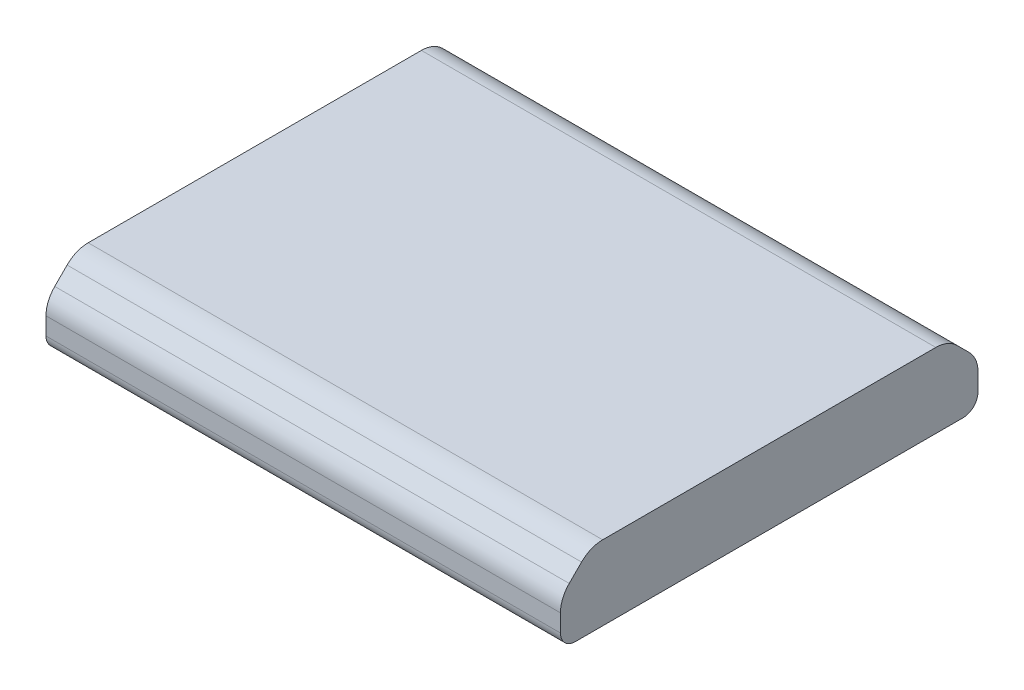
ISO-10303-21;
HEADER;
FILE_DESCRIPTION(('STEP AP214'),'2;1');
FILE_NAME('part.step','',(''),(''),'','','');
FILE_SCHEMA(('AUTOMOTIVE_DESIGN { 1 0 10303 214 1 1 1 1 }'));
ENDSEC;
DATA;
#1=APPLICATION_CONTEXT('core data for automotive mechanical design processes');
#2=APPLICATION_PROTOCOL_DEFINITION('international standard','automotive_design',2000,#1);
#3=PRODUCT_CONTEXT('',#1,'mechanical');
#4=PRODUCT('Part','Part','',(#3));
#5=PRODUCT_RELATED_PRODUCT_CATEGORY('part','',(#4));
#6=PRODUCT_DEFINITION_FORMATION('','',#4);
#7=PRODUCT_DEFINITION_CONTEXT('part definition',#1,'design');
#8=PRODUCT_DEFINITION('design','',#6,#7);
#9=PRODUCT_DEFINITION_SHAPE('','',#8);
#10=(LENGTH_UNIT() NAMED_UNIT(*) SI_UNIT(.MILLI.,.METRE.));
#11=(NAMED_UNIT(*) PLANE_ANGLE_UNIT() SI_UNIT($,.RADIAN.));
#12=(NAMED_UNIT(*) SI_UNIT($,.STERADIAN.) SOLID_ANGLE_UNIT());
#13=UNCERTAINTY_MEASURE_WITH_UNIT(LENGTH_MEASURE(1.E-05),#10,'distance_accuracy_value','');
#14=(GEOMETRIC_REPRESENTATION_CONTEXT(3) GLOBAL_UNCERTAINTY_ASSIGNED_CONTEXT((#13)) GLOBAL_UNIT_ASSIGNED_CONTEXT((#10,
#11,#12)) REPRESENTATION_CONTEXT('',''));
#15=CARTESIAN_POINT('',(0.,0.,0.));
#16=DIRECTION('',(0.,0.,1.));
#17=DIRECTION('',(1.,0.,0.));
#18=AXIS2_PLACEMENT_3D('',#15,#16,#17);
#19=CARTESIAN_POINT('',(34.,0.,-28.));
#20=DIRECTION('',(0.,0.,-1.));
#21=DIRECTION('',(0.,1.,0.));
#22=AXIS2_PLACEMENT_3D('',#19,#20,#21);
#23=PLANE('',#22);
#24=DIRECTION('',(0.,-1.,0.));
#25=VECTOR('',#24,1.);
#26=CARTESIAN_POINT('',(-35.,0.,-28.));
#27=LINE('',#26,#25);
#28=CARTESIAN_POINT('',(-35.,-13.6568542494924,-28.));
#29=VERTEX_POINT('',#28);
#30=CARTESIAN_POINT('',(-35.,-16.,-28.));
#31=VERTEX_POINT('',#30);
#32=EDGE_CURVE('E160',#29,#31,#27,.T.);
#33=ORIENTED_EDGE('',*,*,#32,.F.);
#34=DIRECTION('',(-1.,0.,0.));
#35=VECTOR('',#34,1.);
#36=CARTESIAN_POINT('',(34.,-13.6568542494924,-28.));
#37=LINE('',#36,#35);
#38=CARTESIAN_POINT('',(34.,-13.6568542494924,-28.));
#39=VERTEX_POINT('',#38);
#40=EDGE_CURVE('E11',#39,#29,#37,.T.);
#41=ORIENTED_EDGE('',*,*,#40,.F.);
#42=DIRECTION('',(0.,-1.,0.));
#43=VECTOR('',#42,1.);
#44=CARTESIAN_POINT('',(34.,0.,-28.));
#45=LINE('',#44,#43);
#46=CARTESIAN_POINT('',(34.,-16.,-28.));
#47=VERTEX_POINT('',#46);
#48=EDGE_CURVE('E189',#39,#47,#45,.T.);
#49=ORIENTED_EDGE('',*,*,#48,.T.);
#50=DIRECTION('',(-1.,0.,0.));
#51=VECTOR('',#50,1.);
#52=CARTESIAN_POINT('',(34.,-16.,-28.));
#53=LINE('',#52,#51);
#54=EDGE_CURVE('E57',#47,#31,#53,.T.);
#55=ORIENTED_EDGE('',*,*,#54,.T.);
#56=EDGE_LOOP('',(#33,#41,#49,#55));
#57=FACE_BOUND('',#56,.T.);
#58=ADVANCED_FACE('F41',(#57),#23,.T.);
#59=CARTESIAN_POINT('',(34.,-13.6568542494924,-24.));
#60=DIRECTION('',(-1.,0.,0.));
#61=DIRECTION('',(0.,0.,1.));
#62=AXIS2_PLACEMENT_3D('',#59,#60,#61);
#63=CYLINDRICAL_SURFACE('',#62,4.);
#64=CARTESIAN_POINT('',(-35.,-13.6568542494924,-24.));
#65=DIRECTION('',(1.,0.,0.));
#66=DIRECTION('',(0.,0.,-1.));
#67=AXIS2_PLACEMENT_3D('',#64,#65,#66);
#68=CIRCLE('',#67,4.);
#69=CARTESIAN_POINT('',(-35.,-10.8284271247462,-26.8284271247462));
#70=VERTEX_POINT('',#69);
#71=EDGE_CURVE('E162',#29,#70,#68,.T.);
#72=ORIENTED_EDGE('',*,*,#71,.T.);
#73=DIRECTION('',(-1.,0.,0.));
#74=VECTOR('',#73,1.);
#75=CARTESIAN_POINT('',(34.,-10.8284271247462,-26.8284271247462));
#76=LINE('',#75,#74);
#77=CARTESIAN_POINT('',(34.,-10.8284271247462,-26.8284271247462));
#78=VERTEX_POINT('',#77);
#79=EDGE_CURVE('E49',#78,#70,#76,.T.);
#80=ORIENTED_EDGE('',*,*,#79,.F.);
#81=CARTESIAN_POINT('',(34.,-13.6568542494924,-24.));
#82=DIRECTION('',(1.,0.,0.));
#83=DIRECTION('',(0.,0.,-1.));
#84=AXIS2_PLACEMENT_3D('',#81,#82,#83);
#85=CIRCLE('',#84,4.);
#86=EDGE_CURVE('E231',#39,#78,#85,.T.);
#87=ORIENTED_EDGE('',*,*,#86,.F.);
#88=ORIENTED_EDGE('',*,*,#40,.T.);
#89=EDGE_LOOP('',(#72,#80,#87,#88));
#90=FACE_BOUND('',#89,.T.);
#91=ADVANCED_FACE('F216',(#90),#63,.T.);
#92=CARTESIAN_POINT('',(34.,7.99999999999999,-7.99999999999997));
#93=DIRECTION('',(0.,0.707106781186549,-0.707106781186546));
#94=DIRECTION('',(0.,0.707106781186546,0.707106781186549));
#95=AXIS2_PLACEMENT_3D('',#92,#93,#94);
#96=PLANE('',#95);
#97=DIRECTION('',(0.,-0.707106781186546,-0.707106781186549));
#98=VECTOR('',#97,1.);
#99=CARTESIAN_POINT('',(-35.,7.99999999999999,-7.99999999999997));
#100=LINE('',#99,#98);
#101=CARTESIAN_POINT('',(-35.,-9.1715728752538,-25.1715728752538));
#102=VERTEX_POINT('',#101);
#103=EDGE_CURVE('E165',#102,#70,#100,.T.);
#104=ORIENTED_EDGE('',*,*,#103,.F.);
#105=DIRECTION('',(-1.,0.,0.));
#106=VECTOR('',#105,1.);
#107=CARTESIAN_POINT('',(34.,-9.1715728752538,-25.1715728752538));
#108=LINE('',#107,#106);
#109=CARTESIAN_POINT('',(34.,-9.1715728752538,-25.1715728752538));
#110=VERTEX_POINT('',#109);
#111=EDGE_CURVE('E206',#110,#102,#108,.T.);
#112=ORIENTED_EDGE('',*,*,#111,.F.);
#113=DIRECTION('',(0.,-0.707106781186546,-0.707106781186549));
#114=VECTOR('',#113,1.);
#115=CARTESIAN_POINT('',(34.,7.99999999999999,-7.99999999999997));
#116=LINE('',#115,#114);
#117=EDGE_CURVE('E213',#110,#78,#116,.T.);
#118=ORIENTED_EDGE('',*,*,#117,.T.);
#119=ORIENTED_EDGE('',*,*,#79,.T.);
#120=EDGE_LOOP('',(#104,#112,#118,#119));
#121=FACE_BOUND('',#120,.T.);
#122=ADVANCED_FACE('F211',(#121),#96,.T.);
#123=CARTESIAN_POINT('',(34.,-12.,-22.3431457505076));
#124=DIRECTION('',(-1.,0.,0.));
#125=DIRECTION('',(0.,0.,1.));
#126=AXIS2_PLACEMENT_3D('',#123,#124,#125);
#127=CYLINDRICAL_SURFACE('',#126,4.);
#128=CARTESIAN_POINT('',(-35.,-12.,-22.3431457505076));
#129=DIRECTION('',(1.,0.,0.));
#130=DIRECTION('',(0.,0.,-1.));
#131=AXIS2_PLACEMENT_3D('',#128,#129,#130);
#132=CIRCLE('',#131,4.);
#133=CARTESIAN_POINT('',(-35.,-7.99999999999999,-22.3431457505076));
#134=VERTEX_POINT('',#133);
#135=EDGE_CURVE('E168',#102,#134,#132,.T.);
#136=ORIENTED_EDGE('',*,*,#135,.T.);
#137=DIRECTION('',(-1.,0.,0.));
#138=VECTOR('',#137,1.);
#139=CARTESIAN_POINT('',(34.,-7.99999999999999,-22.3431457505076));
#140=LINE('',#139,#138);
#141=CARTESIAN_POINT('',(34.,-7.99999999999999,-22.3431457505076));
#142=VERTEX_POINT('',#141);
#143=EDGE_CURVE('E204',#142,#134,#140,.T.);
#144=ORIENTED_EDGE('',*,*,#143,.F.);
#145=CARTESIAN_POINT('',(34.,-12.,-22.3431457505076));
#146=DIRECTION('',(1.,0.,0.));
#147=DIRECTION('',(0.,0.,-1.));
#148=AXIS2_PLACEMENT_3D('',#145,#146,#147);
#149=CIRCLE('',#148,4.);
#150=EDGE_CURVE('E227',#110,#142,#149,.T.);
#151=ORIENTED_EDGE('',*,*,#150,.F.);
#152=ORIENTED_EDGE('',*,*,#111,.T.);
#153=EDGE_LOOP('',(#136,#144,#151,#152));
#154=FACE_BOUND('',#153,.T.);
#155=ADVANCED_FACE('F224',(#154),#127,.T.);
#156=CARTESIAN_POINT('',(34.,-7.99999999999999,0.));
#157=DIRECTION('',(0.,1.,0.));
#158=DIRECTION('',(0.,0.,1.));
#159=AXIS2_PLACEMENT_3D('',#156,#157,#158);
#160=PLANE('',#159);
#161=DIRECTION('',(0.,0.,-1.));
#162=VECTOR('',#161,1.);
#163=CARTESIAN_POINT('',(-35.,-7.99999999999999,0.));
#164=LINE('',#163,#162);
#165=CARTESIAN_POINT('',(-35.,-7.99999999999999,22.3431457505076));
#166=VERTEX_POINT('',#165);
#167=EDGE_CURVE('E171',#166,#134,#164,.T.);
#168=ORIENTED_EDGE('',*,*,#167,.F.);
#169=DIRECTION('',(-1.,0.,0.));
#170=VECTOR('',#169,1.);
#171=CARTESIAN_POINT('',(34.,-7.99999999999999,22.3431457505076));
#172=LINE('',#171,#170);
#173=CARTESIAN_POINT('',(34.,-7.99999999999999,22.3431457505076));
#174=VERTEX_POINT('',#173);
#175=EDGE_CURVE('E202',#174,#166,#172,.T.);
#176=ORIENTED_EDGE('',*,*,#175,.F.);
#177=DIRECTION('',(0.,0.,-1.));
#178=VECTOR('',#177,1.);
#179=CARTESIAN_POINT('',(34.,-7.99999999999999,0.));
#180=LINE('',#179,#178);
#181=EDGE_CURVE('E229',#174,#142,#180,.T.);
#182=ORIENTED_EDGE('',*,*,#181,.T.);
#183=ORIENTED_EDGE('',*,*,#143,.T.);
#184=EDGE_LOOP('',(#168,#176,#182,#183));
#185=FACE_BOUND('',#184,.T.);
#186=ADVANCED_FACE('F271',(#185),#160,.T.);
#187=CARTESIAN_POINT('',(34.,-12.,22.3431457505076));
#188=DIRECTION('',(-1.,0.,0.));
#189=DIRECTION('',(0.,0.,1.));
#190=AXIS2_PLACEMENT_3D('',#187,#188,#189);
#191=CYLINDRICAL_SURFACE('',#190,4.);
#192=CARTESIAN_POINT('',(-35.,-12.,22.3431457505076));
#193=DIRECTION('',(1.,0.,0.));
#194=DIRECTION('',(0.,0.,-1.));
#195=AXIS2_PLACEMENT_3D('',#192,#193,#194);
#196=CIRCLE('',#195,4.);
#197=CARTESIAN_POINT('',(-35.,-9.1715728752538,25.1715728752538));
#198=VERTEX_POINT('',#197);
#199=EDGE_CURVE('E174',#166,#198,#196,.T.);
#200=ORIENTED_EDGE('',*,*,#199,.T.);
#201=DIRECTION('',(-1.,0.,0.));
#202=VECTOR('',#201,1.);
#203=CARTESIAN_POINT('',(34.,-9.1715728752538,25.1715728752538));
#204=LINE('',#203,#202);
#205=CARTESIAN_POINT('',(34.,-9.1715728752538,25.1715728752538));
#206=VERTEX_POINT('',#205);
#207=EDGE_CURVE('E199',#206,#198,#204,.T.);
#208=ORIENTED_EDGE('',*,*,#207,.F.);
#209=CARTESIAN_POINT('',(34.,-12.,22.3431457505076));
#210=DIRECTION('',(1.,0.,0.));
#211=DIRECTION('',(0.,0.,-1.));
#212=AXIS2_PLACEMENT_3D('',#209,#210,#211);
#213=CIRCLE('',#212,4.);
#214=EDGE_CURVE('E237',#174,#206,#213,.T.);
#215=ORIENTED_EDGE('',*,*,#214,.F.);
#216=ORIENTED_EDGE('',*,*,#175,.T.);
#217=EDGE_LOOP('',(#200,#208,#215,#216));
#218=FACE_BOUND('',#217,.T.);
#219=ADVANCED_FACE('F274',(#218),#191,.T.);
#220=CARTESIAN_POINT('',(34.,8.00000000000002,8.00000000000004));
#221=DIRECTION('',(0.,-0.707106781186547,-0.707106781186548));
#222=DIRECTION('',(0.,0.707106781186548,-0.707106781186547));
#223=AXIS2_PLACEMENT_3D('',#220,#221,#222);
#224=PLANE('',#223);
#225=DIRECTION('',(0.,-0.707106781186548,0.707106781186547));
#226=VECTOR('',#225,1.);
#227=CARTESIAN_POINT('',(-35.,8.00000000000002,8.00000000000004));
#228=LINE('',#227,#226);
#229=CARTESIAN_POINT('',(-35.,-10.8284271247462,26.8284271247462));
#230=VERTEX_POINT('',#229);
#231=EDGE_CURVE('E176',#198,#230,#228,.T.);
#232=ORIENTED_EDGE('',*,*,#231,.T.);
#233=DIRECTION('',(-1.,0.,0.));
#234=VECTOR('',#233,1.);
#235=CARTESIAN_POINT('',(34.,-10.8284271247462,26.8284271247462));
#236=LINE('',#235,#234);
#237=CARTESIAN_POINT('',(34.,-10.8284271247462,26.8284271247462));
#238=VERTEX_POINT('',#237);
#239=EDGE_CURVE('E196',#238,#230,#236,.T.);
#240=ORIENTED_EDGE('',*,*,#239,.F.);
#241=DIRECTION('',(0.,-0.707106781186548,0.707106781186547));
#242=VECTOR('',#241,1.);
#243=CARTESIAN_POINT('',(34.,8.00000000000002,8.00000000000004));
#244=LINE('',#243,#242);
#245=EDGE_CURVE('E239',#206,#238,#244,.T.);
#246=ORIENTED_EDGE('',*,*,#245,.F.);
#247=ORIENTED_EDGE('',*,*,#207,.T.);
#248=EDGE_LOOP('',(#232,#240,#246,#247));
#249=FACE_BOUND('',#248,.T.);
#250=ADVANCED_FACE('F278',(#249),#224,.F.);
#251=CARTESIAN_POINT('',(34.,-13.6568542494924,24.));
#252=DIRECTION('',(-1.,0.,0.));
#253=DIRECTION('',(0.,0.,1.));
#254=AXIS2_PLACEMENT_3D('',#251,#252,#253);
#255=CYLINDRICAL_SURFACE('',#254,4.);
#256=CARTESIAN_POINT('',(-35.,-13.6568542494924,24.));
#257=DIRECTION('',(1.,0.,0.));
#258=DIRECTION('',(0.,0.,-1.));
#259=AXIS2_PLACEMENT_3D('',#256,#257,#258);
#260=CIRCLE('',#259,4.);
#261=CARTESIAN_POINT('',(-35.,-13.6568542494924,28.));
#262=VERTEX_POINT('',#261);
#263=EDGE_CURVE('E178',#230,#262,#260,.T.);
#264=ORIENTED_EDGE('',*,*,#263,.T.);
#265=DIRECTION('',(-1.,0.,0.));
#266=VECTOR('',#265,1.);
#267=CARTESIAN_POINT('',(34.,-13.6568542494924,28.));
#268=LINE('',#267,#266);
#269=CARTESIAN_POINT('',(34.,-13.6568542494924,28.));
#270=VERTEX_POINT('',#269);
#271=EDGE_CURVE('E193',#270,#262,#268,.T.);
#272=ORIENTED_EDGE('',*,*,#271,.F.);
#273=CARTESIAN_POINT('',(34.,-13.6568542494924,24.));
#274=DIRECTION('',(1.,0.,0.));
#275=DIRECTION('',(0.,0.,-1.));
#276=AXIS2_PLACEMENT_3D('',#273,#274,#275);
#277=CIRCLE('',#276,4.);
#278=EDGE_CURVE('E155',#238,#270,#277,.T.);
#279=ORIENTED_EDGE('',*,*,#278,.F.);
#280=ORIENTED_EDGE('',*,*,#239,.T.);
#281=EDGE_LOOP('',(#264,#272,#279,#280));
#282=FACE_BOUND('',#281,.T.);
#283=ADVANCED_FACE('F245',(#282),#255,.T.);
#284=CARTESIAN_POINT('',(34.,0.,28.));
#285=DIRECTION('',(0.,0.,-1.));
#286=DIRECTION('',(0.,1.,0.));
#287=AXIS2_PLACEMENT_3D('',#284,#285,#286);
#288=PLANE('',#287);
#289=DIRECTION('',(0.,-1.,0.));
#290=VECTOR('',#289,1.);
#291=CARTESIAN_POINT('',(-35.,0.,28.));
#292=LINE('',#291,#290);
#293=CARTESIAN_POINT('',(-35.,-16.,28.));
#294=VERTEX_POINT('',#293);
#295=EDGE_CURVE('E180',#262,#294,#292,.T.);
#296=ORIENTED_EDGE('',*,*,#295,.T.);
#297=DIRECTION('',(-1.,0.,0.));
#298=VECTOR('',#297,1.);
#299=CARTESIAN_POINT('',(34.,-16.,28.));
#300=LINE('',#299,#298);
#301=CARTESIAN_POINT('',(34.,-16.,28.));
#302=VERTEX_POINT('',#301);
#303=EDGE_CURVE('E141',#302,#294,#300,.T.);
#304=ORIENTED_EDGE('',*,*,#303,.F.);
#305=DIRECTION('',(0.,-1.,0.));
#306=VECTOR('',#305,1.);
#307=CARTESIAN_POINT('',(34.,0.,28.));
#308=LINE('',#307,#306);
#309=EDGE_CURVE('E152',#270,#302,#308,.T.);
#310=ORIENTED_EDGE('',*,*,#309,.F.);
#311=ORIENTED_EDGE('',*,*,#271,.T.);
#312=EDGE_LOOP('',(#296,#304,#310,#311));
#313=FACE_BOUND('',#312,.T.);
#314=ADVANCED_FACE('F249',(#313),#288,.F.);
#315=CARTESIAN_POINT('',(34.,-16.,26.));
#316=DIRECTION('',(-1.,0.,0.));
#317=DIRECTION('',(0.,0.,1.));
#318=AXIS2_PLACEMENT_3D('',#315,#316,#317);
#319=CYLINDRICAL_SURFACE('',#318,2.);
#320=CARTESIAN_POINT('',(-35.,-16.,26.));
#321=DIRECTION('',(1.,0.,0.));
#322=DIRECTION('',(0.,0.,-1.));
#323=AXIS2_PLACEMENT_3D('',#320,#321,#322);
#324=CIRCLE('',#323,2.);
#325=CARTESIAN_POINT('',(-35.,-18.,26.));
#326=VERTEX_POINT('',#325);
#327=EDGE_CURVE('E138',#326,#294,#324,.F.);
#328=ORIENTED_EDGE('',*,*,#327,.F.);
#329=DIRECTION('',(-1.,0.,0.));
#330=VECTOR('',#329,1.);
#331=CARTESIAN_POINT('',(34.,-18.,26.));
#332=LINE('',#331,#330);
#333=CARTESIAN_POINT('',(34.,-18.,26.));
#334=VERTEX_POINT('',#333);
#335=EDGE_CURVE('E132',#334,#326,#332,.T.);
#336=ORIENTED_EDGE('',*,*,#335,.F.);
#337=CARTESIAN_POINT('',(34.,-16.,26.));
#338=DIRECTION('',(1.,0.,0.));
#339=DIRECTION('',(0.,0.,-1.));
#340=AXIS2_PLACEMENT_3D('',#337,#338,#339);
#341=CIRCLE('',#340,2.);
#342=EDGE_CURVE('E136',#334,#302,#341,.F.);
#343=ORIENTED_EDGE('',*,*,#342,.T.);
#344=ORIENTED_EDGE('',*,*,#303,.T.);
#345=EDGE_LOOP('',(#328,#336,#343,#344));
#346=FACE_BOUND('',#345,.T.);
#347=ADVANCED_FACE('F134',(#346),#319,.T.);
#348=CARTESIAN_POINT('',(34.,-18.,0.));
#349=DIRECTION('',(0.,1.,0.));
#350=DIRECTION('',(0.,0.,1.));
#351=AXIS2_PLACEMENT_3D('',#348,#349,#350);
#352=PLANE('',#351);
#353=DIRECTION('',(0.,0.,-1.));
#354=VECTOR('',#353,1.);
#355=CARTESIAN_POINT('',(-35.,-18.,0.));
#356=LINE('',#355,#354);
#357=CARTESIAN_POINT('',(-35.,-18.,-26.));
#358=VERTEX_POINT('',#357);
#359=EDGE_CURVE('E184',#326,#358,#356,.T.);
#360=ORIENTED_EDGE('',*,*,#359,.T.);
#361=DIRECTION('',(-1.,0.,0.));
#362=VECTOR('',#361,1.);
#363=CARTESIAN_POINT('',(34.,-18.,-26.));
#364=LINE('',#363,#362);
#365=CARTESIAN_POINT('',(34.,-18.,-26.));
#366=VERTEX_POINT('',#365);
#367=EDGE_CURVE('E95',#366,#358,#364,.T.);
#368=ORIENTED_EDGE('',*,*,#367,.F.);
#369=DIRECTION('',(0.,0.,-1.));
#370=VECTOR('',#369,1.);
#371=CARTESIAN_POINT('',(34.,-18.,0.));
#372=LINE('',#371,#370);
#373=EDGE_CURVE('E143',#334,#366,#372,.T.);
#374=ORIENTED_EDGE('',*,*,#373,.F.);
#375=ORIENTED_EDGE('',*,*,#335,.T.);
#376=EDGE_LOOP('',(#360,#368,#374,#375));
#377=FACE_BOUND('',#376,.T.);
#378=ADVANCED_FACE('F144',(#377),#352,.F.);
#379=CARTESIAN_POINT('',(34.,-16.,-26.));
#380=DIRECTION('',(-1.,0.,0.));
#381=DIRECTION('',(0.,0.,1.));
#382=AXIS2_PLACEMENT_3D('',#379,#380,#381);
#383=CYLINDRICAL_SURFACE('',#382,2.);
#384=CARTESIAN_POINT('',(-35.,-16.,-26.));
#385=DIRECTION('',(1.,0.,0.));
#386=DIRECTION('',(0.,0.,-1.));
#387=AXIS2_PLACEMENT_3D('',#384,#385,#386);
#388=CIRCLE('',#387,2.);
#389=EDGE_CURVE('E186',#31,#358,#388,.F.);
#390=ORIENTED_EDGE('',*,*,#389,.F.);
#391=ORIENTED_EDGE('',*,*,#54,.F.);
#392=CARTESIAN_POINT('',(34.,-16.,-26.));
#393=DIRECTION('',(1.,0.,0.));
#394=DIRECTION('',(0.,0.,-1.));
#395=AXIS2_PLACEMENT_3D('',#392,#393,#394);
#396=CIRCLE('',#395,2.);
#397=EDGE_CURVE('E147',#47,#366,#396,.F.);
#398=ORIENTED_EDGE('',*,*,#397,.T.);
#399=ORIENTED_EDGE('',*,*,#367,.T.);
#400=EDGE_LOOP('',(#390,#391,#398,#399));
#401=FACE_BOUND('',#400,.T.);
#402=ADVANCED_FACE('F250',(#401),#383,.T.);
#403=CARTESIAN_POINT('',(34.,0.,0.));
#404=DIRECTION('',(1.,0.,0.));
#405=DIRECTION('',(0.,0.,-1.));
#406=AXIS2_PLACEMENT_3D('',#403,#404,#405);
#407=PLANE('',#406);
#408=ORIENTED_EDGE('',*,*,#48,.F.);
#409=ORIENTED_EDGE('',*,*,#86,.T.);
#410=ORIENTED_EDGE('',*,*,#117,.F.);
#411=ORIENTED_EDGE('',*,*,#150,.T.);
#412=ORIENTED_EDGE('',*,*,#181,.F.);
#413=ORIENTED_EDGE('',*,*,#214,.T.);
#414=ORIENTED_EDGE('',*,*,#245,.T.);
#415=ORIENTED_EDGE('',*,*,#278,.T.);
#416=ORIENTED_EDGE('',*,*,#309,.T.);
#417=ORIENTED_EDGE('',*,*,#342,.F.);
#418=ORIENTED_EDGE('',*,*,#373,.T.);
#419=ORIENTED_EDGE('',*,*,#397,.F.);
#420=EDGE_LOOP('',(#408,#409,#410,#411,#412,#413,#414,#415,#416,#417,#418,#419));
#421=FACE_BOUND('',#420,.T.);
#422=ADVANCED_FACE('F150',(#421),#407,.T.);
#423=CARTESIAN_POINT('',(-35.,0.,0.));
#424=DIRECTION('',(1.,0.,0.));
#425=DIRECTION('',(0.,0.,-1.));
#426=AXIS2_PLACEMENT_3D('',#423,#424,#425);
#427=PLANE('',#426);
#428=ORIENTED_EDGE('',*,*,#32,.T.);
#429=ORIENTED_EDGE('',*,*,#389,.T.);
#430=ORIENTED_EDGE('',*,*,#359,.F.);
#431=ORIENTED_EDGE('',*,*,#327,.T.);
#432=ORIENTED_EDGE('',*,*,#295,.F.);
#433=ORIENTED_EDGE('',*,*,#263,.F.);
#434=ORIENTED_EDGE('',*,*,#231,.F.);
#435=ORIENTED_EDGE('',*,*,#199,.F.);
#436=ORIENTED_EDGE('',*,*,#167,.T.);
#437=ORIENTED_EDGE('',*,*,#135,.F.);
#438=ORIENTED_EDGE('',*,*,#103,.T.);
#439=ORIENTED_EDGE('',*,*,#71,.F.);
#440=EDGE_LOOP('',(#428,#429,#430,#431,#432,#433,#434,#435,#436,#437,#438,#439));
#441=FACE_BOUND('',#440,.T.);
#442=ADVANCED_FACE('F219',(#441),#427,.F.);
#443=CLOSED_SHELL('',(#58,#91,#122,#155,#186,#219,#250,#283,#314,#347,#378,#402,#422,#442));
#444=MANIFOLD_SOLID_BREP('B2',#443);
#445=ADVANCED_BREP_SHAPE_REPRESENTATION('',(#18,#444),#14);
#446=SHAPE_DEFINITION_REPRESENTATION(#9,#445);
ENDSEC;
END-ISO-10303-21;
